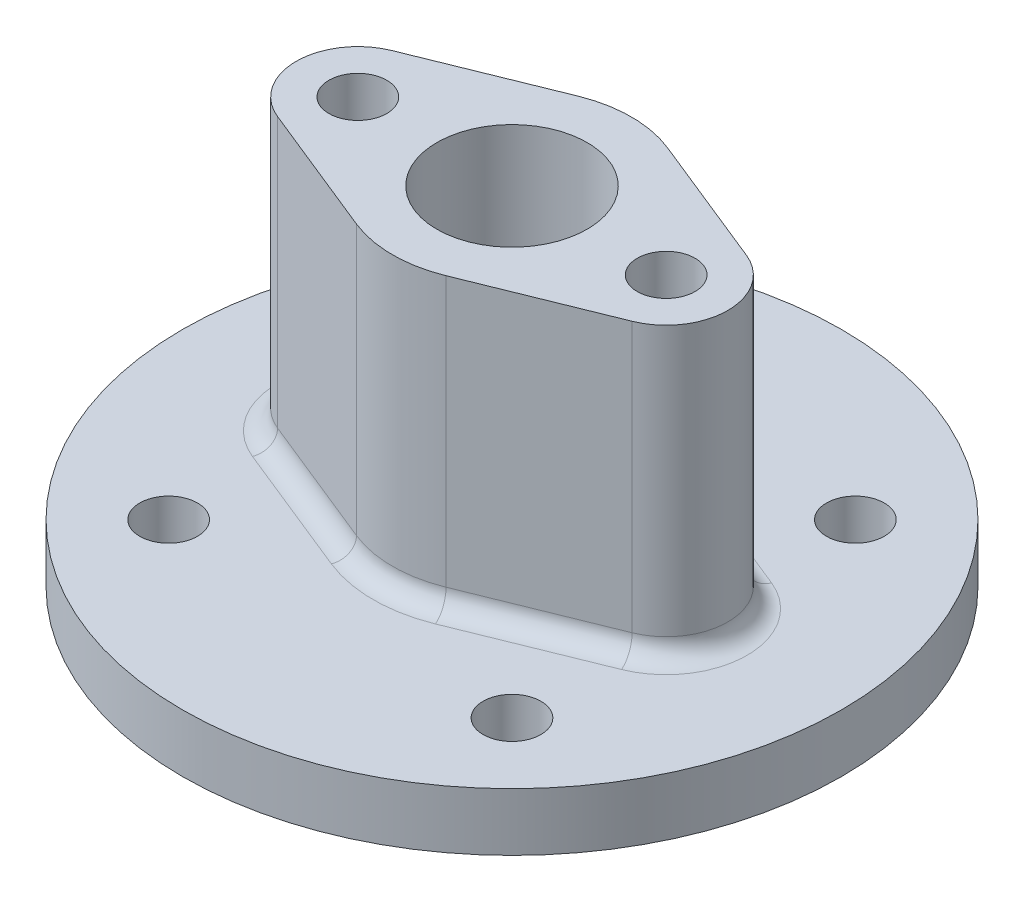
ISO-10303-21;
HEADER;
FILE_DESCRIPTION(('STEP AP214'),'2;1');
FILE_NAME('part.step','',(''),(''),'','','');
FILE_SCHEMA(('AUTOMOTIVE_DESIGN { 1 0 10303 214 1 1 1 1 }'));
ENDSEC;
DATA;
#1=APPLICATION_CONTEXT('core data for automotive mechanical design processes');
#2=APPLICATION_PROTOCOL_DEFINITION('international standard','automotive_design',2000,#1);
#3=PRODUCT_CONTEXT('',#1,'mechanical');
#4=PRODUCT('Part','Part','',(#3));
#5=PRODUCT_RELATED_PRODUCT_CATEGORY('part','',(#4));
#6=PRODUCT_DEFINITION_FORMATION('','',#4);
#7=PRODUCT_DEFINITION_CONTEXT('part definition',#1,'design');
#8=PRODUCT_DEFINITION('design','',#6,#7);
#9=PRODUCT_DEFINITION_SHAPE('','',#8);
#10=(LENGTH_UNIT() NAMED_UNIT(*) SI_UNIT(.MILLI.,.METRE.));
#11=(NAMED_UNIT(*) PLANE_ANGLE_UNIT() SI_UNIT($,.RADIAN.));
#12=(NAMED_UNIT(*) SI_UNIT($,.STERADIAN.) SOLID_ANGLE_UNIT());
#13=UNCERTAINTY_MEASURE_WITH_UNIT(LENGTH_MEASURE(1.E-05),#10,'distance_accuracy_value','');
#14=(GEOMETRIC_REPRESENTATION_CONTEXT(3) GLOBAL_UNCERTAINTY_ASSIGNED_CONTEXT((#13)) GLOBAL_UNIT_ASSIGNED_CONTEXT((#10,
#11,#12)) REPRESENTATION_CONTEXT('',''));
#15=CARTESIAN_POINT('',(0.,0.,0.));
#16=DIRECTION('',(0.,0.,1.));
#17=DIRECTION('',(1.,0.,0.));
#18=AXIS2_PLACEMENT_3D('',#15,#16,#17);
#19=CARTESIAN_POINT('',(11.625,75.,-28.7377691374957));
#20=DIRECTION('',(0.375,0.,-0.927024810886958));
#21=DIRECTION('',(-0.927024810886958,0.,-0.375));
#22=AXIS2_PLACEMENT_3D('',#19,#20,#21);
#23=PLANE('',#22);
#24=DIRECTION('',(0.,-1.,0.));
#25=VECTOR('',#24,1.);
#26=CARTESIAN_POINT('',(46.,75.,-14.8323969741913));
#27=LINE('',#26,#25);
#28=CARTESIAN_POINT('',(46.,75.,-14.8323969741913));
#29=VERTEX_POINT('',#28);
#30=CARTESIAN_POINT('',(46.,5.,-14.8323969741913));
#31=VERTEX_POINT('',#30);
#32=EDGE_CURVE('E243',#29,#31,#27,.T.);
#33=ORIENTED_EDGE('',*,*,#32,.T.);
#34=DIRECTION('',(0.927024810886958,0.,0.375));
#35=VECTOR('',#34,1.);
#36=CARTESIAN_POINT('',(11.625,5.,-28.7377691374957));
#37=LINE('',#36,#35);
#38=CARTESIAN_POINT('',(11.625,5.,-28.7377691374957));
#39=VERTEX_POINT('',#38);
#40=EDGE_CURVE('E316',#31,#39,#37,.F.);
#41=ORIENTED_EDGE('',*,*,#40,.T.);
#42=DIRECTION('',(0.,-1.,0.));
#43=VECTOR('',#42,1.);
#44=CARTESIAN_POINT('',(11.625,75.,-28.7377691374957));
#45=LINE('',#44,#43);
#46=CARTESIAN_POINT('',(11.625,75.,-28.7377691374957));
#47=VERTEX_POINT('',#46);
#48=EDGE_CURVE('E268',#47,#39,#45,.T.);
#49=ORIENTED_EDGE('',*,*,#48,.F.);
#50=DIRECTION('',(0.927024810886958,0.,0.375));
#51=VECTOR('',#50,1.);
#52=CARTESIAN_POINT('',(11.625,75.,-28.7377691374957));
#53=LINE('',#52,#51);
#54=EDGE_CURVE('E198',#47,#29,#53,.T.);
#55=ORIENTED_EDGE('',*,*,#54,.T.);
#56=EDGE_LOOP('',(#33,#41,#49,#55));
#57=FACE_BOUND('',#56,.T.);
#58=ADVANCED_FACE('F53',(#57),#23,.T.);
#59=CARTESIAN_POINT('',(0.,75.,0.));
#60=DIRECTION('',(0.,-1.,0.));
#61=DIRECTION('',(0.,0.,-1.));
#62=AXIS2_PLACEMENT_3D('',#59,#60,#61);
#63=CYLINDRICAL_SURFACE('',#62,31.);
#64=ORIENTED_EDGE('',*,*,#48,.T.);
#65=CARTESIAN_POINT('',(0.,5.,0.));
#66=DIRECTION('',(0.,1.,0.));
#67=DIRECTION('',(0.,0.,1.));
#68=AXIS2_PLACEMENT_3D('',#65,#66,#67);
#69=CIRCLE('',#68,31.);
#70=CARTESIAN_POINT('',(-11.625,5.,-28.7377691374957));
#71=VERTEX_POINT('',#70);
#72=EDGE_CURVE('E313',#39,#71,#69,.T.);
#73=ORIENTED_EDGE('',*,*,#72,.T.);
#74=DIRECTION('',(0.,-1.,0.));
#75=VECTOR('',#74,1.);
#76=CARTESIAN_POINT('',(-11.625,75.,-28.7377691374957));
#77=LINE('',#76,#75);
#78=CARTESIAN_POINT('',(-11.625,75.,-28.7377691374957));
#79=VERTEX_POINT('',#78);
#80=EDGE_CURVE('E264',#79,#71,#77,.T.);
#81=ORIENTED_EDGE('',*,*,#80,.F.);
#82=CARTESIAN_POINT('',(0.,75.,0.));
#83=DIRECTION('',(0.,1.,0.));
#84=DIRECTION('',(0.,0.,1.));
#85=AXIS2_PLACEMENT_3D('',#82,#83,#84);
#86=CIRCLE('',#85,31.);
#87=EDGE_CURVE('E220',#47,#79,#86,.T.);
#88=ORIENTED_EDGE('',*,*,#87,.F.);
#89=EDGE_LOOP('',(#64,#73,#81,#88));
#90=FACE_BOUND('',#89,.T.);
#91=ADVANCED_FACE('F467',(#90),#63,.T.);
#92=CARTESIAN_POINT('',(-11.625,75.,-28.7377691374957));
#93=DIRECTION('',(0.375,0.,0.927024810886958));
#94=DIRECTION('',(0.927024810886958,0.,-0.375));
#95=AXIS2_PLACEMENT_3D('',#92,#93,#94);
#96=PLANE('',#95);
#97=ORIENTED_EDGE('',*,*,#80,.T.);
#98=DIRECTION('',(-0.927024810886958,0.,0.375));
#99=VECTOR('',#98,1.);
#100=CARTESIAN_POINT('',(-11.625,5.,-28.7377691374957));
#101=LINE('',#100,#99);
#102=CARTESIAN_POINT('',(-46.,5.,-14.8323969741913));
#103=VERTEX_POINT('',#102);
#104=EDGE_CURVE('E310',#71,#103,#101,.T.);
#105=ORIENTED_EDGE('',*,*,#104,.T.);
#106=DIRECTION('',(0.,-1.,0.));
#107=VECTOR('',#106,1.);
#108=CARTESIAN_POINT('',(-46.,75.,-14.8323969741913));
#109=LINE('',#108,#107);
#110=CARTESIAN_POINT('',(-46.,75.,-14.8323969741913));
#111=VERTEX_POINT('',#110);
#112=EDGE_CURVE('E260',#111,#103,#109,.T.);
#113=ORIENTED_EDGE('',*,*,#112,.F.);
#114=DIRECTION('',(-0.927024810886958,0.,0.375));
#115=VECTOR('',#114,1.);
#116=CARTESIAN_POINT('',(-11.625,75.,-28.7377691374957));
#117=LINE('',#116,#115);
#118=EDGE_CURVE('E223',#79,#111,#117,.T.);
#119=ORIENTED_EDGE('',*,*,#118,.F.);
#120=EDGE_LOOP('',(#97,#105,#113,#119));
#121=FACE_BOUND('',#120,.T.);
#122=ADVANCED_FACE('F473',(#121),#96,.F.);
#123=CARTESIAN_POINT('',(-40.,75.,0.));
#124=DIRECTION('',(0.,-1.,0.));
#125=DIRECTION('',(0.,0.,-1.));
#126=AXIS2_PLACEMENT_3D('',#123,#124,#125);
#127=CYLINDRICAL_SURFACE('',#126,16.);
#128=ORIENTED_EDGE('',*,*,#112,.T.);
#129=CARTESIAN_POINT('',(-40.,5.,0.));
#130=DIRECTION('',(0.,1.,0.));
#131=DIRECTION('',(0.,0.,1.));
#132=AXIS2_PLACEMENT_3D('',#129,#130,#131);
#133=CIRCLE('',#132,16.);
#134=CARTESIAN_POINT('',(-46.,5.,14.8323969741913));
#135=VERTEX_POINT('',#134);
#136=EDGE_CURVE('E307',#103,#135,#133,.T.);
#137=ORIENTED_EDGE('',*,*,#136,.T.);
#138=DIRECTION('',(0.,-1.,0.));
#139=VECTOR('',#138,1.);
#140=CARTESIAN_POINT('',(-46.,75.,14.8323969741913));
#141=LINE('',#140,#139);
#142=CARTESIAN_POINT('',(-46.,75.,14.8323969741913));
#143=VERTEX_POINT('',#142);
#144=EDGE_CURVE('E256',#143,#135,#141,.T.);
#145=ORIENTED_EDGE('',*,*,#144,.F.);
#146=CARTESIAN_POINT('',(-40.,75.,0.));
#147=DIRECTION('',(0.,1.,0.));
#148=DIRECTION('',(0.,0.,1.));
#149=AXIS2_PLACEMENT_3D('',#146,#147,#148);
#150=CIRCLE('',#149,16.);
#151=EDGE_CURVE('E226',#143,#111,#150,.F.);
#152=ORIENTED_EDGE('',*,*,#151,.T.);
#153=EDGE_LOOP('',(#128,#137,#145,#152));
#154=FACE_BOUND('',#153,.T.);
#155=ADVANCED_FACE('F540',(#154),#127,.T.);
#156=CARTESIAN_POINT('',(-11.625,75.,28.7377691374957));
#157=DIRECTION('',(-0.375,0.,0.927024810886958));
#158=DIRECTION('',(0.927024810886958,0.,0.375));
#159=AXIS2_PLACEMENT_3D('',#156,#157,#158);
#160=PLANE('',#159);
#161=ORIENTED_EDGE('',*,*,#144,.T.);
#162=DIRECTION('',(-0.927024810886958,0.,-0.375));
#163=VECTOR('',#162,1.);
#164=CARTESIAN_POINT('',(-11.625,5.,28.7377691374957));
#165=LINE('',#164,#163);
#166=CARTESIAN_POINT('',(-11.625,5.,28.7377691374957));
#167=VERTEX_POINT('',#166);
#168=EDGE_CURVE('E303',#135,#167,#165,.F.);
#169=ORIENTED_EDGE('',*,*,#168,.T.);
#170=DIRECTION('',(0.,-1.,0.));
#171=VECTOR('',#170,1.);
#172=CARTESIAN_POINT('',(-11.625,75.,28.7377691374957));
#173=LINE('',#172,#171);
#174=CARTESIAN_POINT('',(-11.625,75.,28.7377691374957));
#175=VERTEX_POINT('',#174);
#176=EDGE_CURVE('E253',#175,#167,#173,.T.);
#177=ORIENTED_EDGE('',*,*,#176,.F.);
#178=DIRECTION('',(-0.927024810886958,0.,-0.375));
#179=VECTOR('',#178,1.);
#180=CARTESIAN_POINT('',(-11.625,75.,28.7377691374957));
#181=LINE('',#180,#179);
#182=EDGE_CURVE('E230',#175,#143,#181,.T.);
#183=ORIENTED_EDGE('',*,*,#182,.T.);
#184=EDGE_LOOP('',(#161,#169,#177,#183));
#185=FACE_BOUND('',#184,.T.);
#186=ADVANCED_FACE('F543',(#185),#160,.T.);
#187=CARTESIAN_POINT('',(0.,75.,0.));
#188=DIRECTION('',(0.,-1.,0.));
#189=DIRECTION('',(0.,0.,-1.));
#190=AXIS2_PLACEMENT_3D('',#187,#188,#189);
#191=CYLINDRICAL_SURFACE('',#190,31.);
#192=ORIENTED_EDGE('',*,*,#176,.T.);
#193=CARTESIAN_POINT('',(0.,5.,0.));
#194=DIRECTION('',(0.,1.,0.));
#195=DIRECTION('',(0.,0.,1.));
#196=AXIS2_PLACEMENT_3D('',#193,#194,#195);
#197=CIRCLE('',#196,31.);
#198=CARTESIAN_POINT('',(11.625,5.,28.7377691374957));
#199=VERTEX_POINT('',#198);
#200=EDGE_CURVE('E12',#167,#199,#197,.T.);
#201=ORIENTED_EDGE('',*,*,#200,.T.);
#202=DIRECTION('',(0.,-1.,0.));
#203=VECTOR('',#202,1.);
#204=CARTESIAN_POINT('',(11.625,75.,28.7377691374957));
#205=LINE('',#204,#203);
#206=CARTESIAN_POINT('',(11.625,75.,28.7377691374957));
#207=VERTEX_POINT('',#206);
#208=EDGE_CURVE('E250',#207,#199,#205,.T.);
#209=ORIENTED_EDGE('',*,*,#208,.F.);
#210=CARTESIAN_POINT('',(0.,75.,0.));
#211=DIRECTION('',(0.,1.,0.));
#212=DIRECTION('',(0.,0.,1.));
#213=AXIS2_PLACEMENT_3D('',#210,#211,#212);
#214=CIRCLE('',#213,31.);
#215=EDGE_CURVE('E234',#175,#207,#214,.T.);
#216=ORIENTED_EDGE('',*,*,#215,.F.);
#217=EDGE_LOOP('',(#192,#201,#209,#216));
#218=FACE_BOUND('',#217,.T.);
#219=ADVANCED_FACE('F547',(#218),#191,.T.);
#220=CARTESIAN_POINT('',(11.625,75.,28.7377691374957));
#221=DIRECTION('',(-0.375,0.,-0.927024810886958));
#222=DIRECTION('',(-0.927024810886958,0.,0.375));
#223=AXIS2_PLACEMENT_3D('',#220,#221,#222);
#224=PLANE('',#223);
#225=ORIENTED_EDGE('',*,*,#208,.T.);
#226=DIRECTION('',(0.927024810886958,0.,-0.375));
#227=VECTOR('',#226,1.);
#228=CARTESIAN_POINT('',(11.625,5.,28.7377691374957));
#229=LINE('',#228,#227);
#230=CARTESIAN_POINT('',(46.,5.,14.8323969741913));
#231=VERTEX_POINT('',#230);
#232=EDGE_CURVE('E63',#199,#231,#229,.T.);
#233=ORIENTED_EDGE('',*,*,#232,.T.);
#234=DIRECTION('',(0.,-1.,0.));
#235=VECTOR('',#234,1.);
#236=CARTESIAN_POINT('',(46.,75.,14.8323969741913));
#237=LINE('',#236,#235);
#238=CARTESIAN_POINT('',(46.,75.,14.8323969741913));
#239=VERTEX_POINT('',#238);
#240=EDGE_CURVE('E247',#239,#231,#237,.T.);
#241=ORIENTED_EDGE('',*,*,#240,.F.);
#242=DIRECTION('',(0.927024810886958,0.,-0.375));
#243=VECTOR('',#242,1.);
#244=CARTESIAN_POINT('',(11.625,75.,28.7377691374957));
#245=LINE('',#244,#243);
#246=EDGE_CURVE('E237',#207,#239,#245,.T.);
#247=ORIENTED_EDGE('',*,*,#246,.F.);
#248=EDGE_LOOP('',(#225,#233,#241,#247));
#249=FACE_BOUND('',#248,.T.);
#250=ADVANCED_FACE('F548',(#249),#224,.F.);
#251=CARTESIAN_POINT('',(40.,75.,0.));
#252=DIRECTION('',(0.,-1.,0.));
#253=DIRECTION('',(0.,0.,-1.));
#254=AXIS2_PLACEMENT_3D('',#251,#252,#253);
#255=CYLINDRICAL_SURFACE('',#254,16.);
#256=ORIENTED_EDGE('',*,*,#240,.T.);
#257=CARTESIAN_POINT('',(40.,5.,0.));
#258=DIRECTION('',(0.,1.,0.));
#259=DIRECTION('',(0.,0.,1.));
#260=AXIS2_PLACEMENT_3D('',#257,#258,#259);
#261=CIRCLE('',#260,16.);
#262=EDGE_CURVE('E319',#231,#31,#261,.T.);
#263=ORIENTED_EDGE('',*,*,#262,.T.);
#264=ORIENTED_EDGE('',*,*,#32,.F.);
#265=CARTESIAN_POINT('',(40.,75.,0.));
#266=DIRECTION('',(0.,1.,0.));
#267=DIRECTION('',(0.,0.,1.));
#268=AXIS2_PLACEMENT_3D('',#265,#266,#267);
#269=CIRCLE('',#268,16.);
#270=EDGE_CURVE('E240',#239,#29,#269,.T.);
#271=ORIENTED_EDGE('',*,*,#270,.F.);
#272=EDGE_LOOP('',(#256,#263,#264,#271));
#273=FACE_BOUND('',#272,.T.);
#274=ADVANCED_FACE('F462',(#273),#255,.T.);
#275=CARTESIAN_POINT('',(0.,75.,0.));
#276=DIRECTION('',(0.,1.,0.));
#277=DIRECTION('',(0.,0.,1.));
#278=AXIS2_PLACEMENT_3D('',#275,#276,#277);
#279=PLANE('',#278);
#280=CARTESIAN_POINT('',(0.,75.,0.));
#281=DIRECTION('',(0.,1.,0.));
#282=DIRECTION('',(0.,0.,1.));
#283=AXIS2_PLACEMENT_3D('',#280,#281,#282);
#284=CIRCLE('',#283,19.5);
#285=CARTESIAN_POINT('',(0.,75.,19.5));
#286=VERTEX_POINT('',#285);
#287=EDGE_CURVE('E278',#286,#286,#284,.T.);
#288=ORIENTED_EDGE('',*,*,#287,.F.);
#289=EDGE_LOOP('',(#288));
#290=FACE_BOUND('',#289,.T.);
#291=CARTESIAN_POINT('',(-40.,75.,0.));
#292=DIRECTION('',(0.,1.,0.));
#293=DIRECTION('',(0.,0.,1.));
#294=AXIS2_PLACEMENT_3D('',#291,#292,#293);
#295=CIRCLE('',#294,7.49999999999999);
#296=CARTESIAN_POINT('',(-40.,75.,7.49999999999998));
#297=VERTEX_POINT('',#296);
#298=EDGE_CURVE('E161',#297,#297,#295,.T.);
#299=ORIENTED_EDGE('',*,*,#298,.F.);
#300=EDGE_LOOP('',(#299));
#301=FACE_BOUND('',#300,.T.);
#302=CARTESIAN_POINT('',(40.,75.,0.));
#303=DIRECTION('',(0.,1.,0.));
#304=DIRECTION('',(0.,0.,1.));
#305=AXIS2_PLACEMENT_3D('',#302,#303,#304);
#306=CIRCLE('',#305,7.49999999999999);
#307=CARTESIAN_POINT('',(40.,75.,7.49999999999998));
#308=VERTEX_POINT('',#307);
#309=EDGE_CURVE('E160',#308,#308,#306,.T.);
#310=ORIENTED_EDGE('',*,*,#309,.F.);
#311=EDGE_LOOP('',(#310));
#312=FACE_BOUND('',#311,.T.);
#313=ORIENTED_EDGE('',*,*,#54,.F.);
#314=ORIENTED_EDGE('',*,*,#87,.T.);
#315=ORIENTED_EDGE('',*,*,#118,.T.);
#316=ORIENTED_EDGE('',*,*,#151,.F.);
#317=ORIENTED_EDGE('',*,*,#182,.F.);
#318=ORIENTED_EDGE('',*,*,#215,.T.);
#319=ORIENTED_EDGE('',*,*,#246,.T.);
#320=ORIENTED_EDGE('',*,*,#270,.T.);
#321=EDGE_LOOP('',(#313,#314,#315,#316,#317,#318,#319,#320));
#322=FACE_BOUND('',#321,.T.);
#323=ADVANCED_FACE('F456',(#290,#301,#312,#322),#279,.T.);
#324=CARTESIAN_POINT('',(0.,0.,0.));
#325=DIRECTION('',(0.,1.,0.));
#326=DIRECTION('',(0.,0.,1.));
#327=AXIS2_PLACEMENT_3D('',#324,#325,#326);
#328=PLANE('',#327);
#329=CARTESIAN_POINT('',(0.,0.,0.));
#330=DIRECTION('',(0.,1.,0.));
#331=DIRECTION('',(0.,0.,1.));
#332=AXIS2_PLACEMENT_3D('',#329,#330,#331);
#333=CIRCLE('',#332,36.);
#334=CARTESIAN_POINT('',(13.5,0.,33.3728931919305));
#335=VERTEX_POINT('',#334);
#336=CARTESIAN_POINT('',(-13.5,0.,33.3728931919305));
#337=VERTEX_POINT('',#336);
#338=EDGE_CURVE('E272',#335,#337,#333,.F.);
#339=ORIENTED_EDGE('',*,*,#338,.T.);
#340=DIRECTION('',(-0.927024810886958,0.,-0.375));
#341=VECTOR('',#340,1.);
#342=CARTESIAN_POINT('',(-47.875,0.,19.4675210286261));
#343=LINE('',#342,#341);
#344=CARTESIAN_POINT('',(-47.875,0.,19.4675210286261));
#345=VERTEX_POINT('',#344);
#346=EDGE_CURVE('E299',#337,#345,#343,.T.);
#347=ORIENTED_EDGE('',*,*,#346,.T.);
#348=CARTESIAN_POINT('',(-40.,0.,0.));
#349=DIRECTION('',(0.,1.,0.));
#350=DIRECTION('',(0.,0.,1.));
#351=AXIS2_PLACEMENT_3D('',#348,#349,#350);
#352=CIRCLE('',#351,21.);
#353=CARTESIAN_POINT('',(-47.875,0.,-19.4675210286261));
#354=VERTEX_POINT('',#353);
#355=EDGE_CURVE('E296',#345,#354,#352,.F.);
#356=ORIENTED_EDGE('',*,*,#355,.T.);
#357=DIRECTION('',(-0.927024810886958,0.,0.375));
#358=VECTOR('',#357,1.);
#359=CARTESIAN_POINT('',(-13.5,0.,-33.3728931919305));
#360=LINE('',#359,#358);
#361=CARTESIAN_POINT('',(-13.5,0.,-33.3728931919305));
#362=VERTEX_POINT('',#361);
#363=EDGE_CURVE('E293',#354,#362,#360,.F.);
#364=ORIENTED_EDGE('',*,*,#363,.T.);
#365=CARTESIAN_POINT('',(0.,0.,0.));
#366=DIRECTION('',(0.,1.,0.));
#367=DIRECTION('',(0.,0.,1.));
#368=AXIS2_PLACEMENT_3D('',#365,#366,#367);
#369=CIRCLE('',#368,36.);
#370=CARTESIAN_POINT('',(13.5,0.,-33.3728931919305));
#371=VERTEX_POINT('',#370);
#372=EDGE_CURVE('E290',#362,#371,#369,.F.);
#373=ORIENTED_EDGE('',*,*,#372,.T.);
#374=DIRECTION('',(0.927024810886958,0.,0.375));
#375=VECTOR('',#374,1.);
#376=CARTESIAN_POINT('',(47.875,0.,-19.4675210286261));
#377=LINE('',#376,#375);
#378=CARTESIAN_POINT('',(47.875,0.,-19.4675210286261));
#379=VERTEX_POINT('',#378);
#380=EDGE_CURVE('E287',#371,#379,#377,.T.);
#381=ORIENTED_EDGE('',*,*,#380,.T.);
#382=CARTESIAN_POINT('',(40.,0.,0.));
#383=DIRECTION('',(0.,1.,0.));
#384=DIRECTION('',(0.,0.,1.));
#385=AXIS2_PLACEMENT_3D('',#382,#383,#384);
#386=CIRCLE('',#385,21.);
#387=CARTESIAN_POINT('',(47.875,0.,19.4675210286261));
#388=VERTEX_POINT('',#387);
#389=EDGE_CURVE('E284',#379,#388,#386,.F.);
#390=ORIENTED_EDGE('',*,*,#389,.T.);
#391=DIRECTION('',(0.927024810886958,0.,-0.375));
#392=VECTOR('',#391,1.);
#393=CARTESIAN_POINT('',(13.5,0.,33.3728931919305));
#394=LINE('',#393,#392);
#395=EDGE_CURVE('E281',#388,#335,#394,.F.);
#396=ORIENTED_EDGE('',*,*,#395,.T.);
#397=EDGE_LOOP('',(#339,#347,#356,#364,#373,#381,#390,#396));
#398=FACE_BOUND('',#397,.T.);
#399=CARTESIAN_POINT('',(-44.5477272147523,0.,-44.5477272147527));
#400=DIRECTION('',(0.,1.,0.));
#401=DIRECTION('',(0.,0.,1.));
#402=AXIS2_PLACEMENT_3D('',#399,#400,#401);
#403=CIRCLE('',#402,7.50000000000001);
#404=CARTESIAN_POINT('',(-44.5477272147523,0.,-37.0477272147527));
#405=VERTEX_POINT('',#404);
#406=EDGE_CURVE('E176',#405,#405,#403,.T.);
#407=ORIENTED_EDGE('',*,*,#406,.F.);
#408=EDGE_LOOP('',(#407));
#409=FACE_BOUND('',#408,.T.);
#410=CARTESIAN_POINT('',(-44.5477272147527,0.,44.5477272147523));
#411=DIRECTION('',(0.,1.,0.));
#412=DIRECTION('',(0.,0.,1.));
#413=AXIS2_PLACEMENT_3D('',#410,#411,#412);
#414=CIRCLE('',#413,7.5);
#415=CARTESIAN_POINT('',(-44.5477272147527,0.,52.0477272147523));
#416=VERTEX_POINT('',#415);
#417=EDGE_CURVE('E202',#416,#416,#414,.T.);
#418=ORIENTED_EDGE('',*,*,#417,.F.);
#419=EDGE_LOOP('',(#418));
#420=FACE_BOUND('',#419,.T.);
#421=CARTESIAN_POINT('',(44.5477272147523,0.,44.5477272147527));
#422=DIRECTION('',(0.,1.,0.));
#423=DIRECTION('',(0.,0.,1.));
#424=AXIS2_PLACEMENT_3D('',#421,#422,#423);
#425=CIRCLE('',#424,7.50000000000001);
#426=CARTESIAN_POINT('',(44.5477272147523,0.,52.0477272147527));
#427=VERTEX_POINT('',#426);
#428=EDGE_CURVE('E206',#427,#427,#425,.T.);
#429=ORIENTED_EDGE('',*,*,#428,.F.);
#430=EDGE_LOOP('',(#429));
#431=FACE_BOUND('',#430,.T.);
#432=CARTESIAN_POINT('',(44.5477272147527,0.,-44.5477272147523));
#433=DIRECTION('',(0.,1.,0.));
#434=DIRECTION('',(0.,0.,1.));
#435=AXIS2_PLACEMENT_3D('',#432,#433,#434);
#436=CIRCLE('',#435,7.49999999999999);
#437=CARTESIAN_POINT('',(44.5477272147527,0.,-37.0477272147523));
#438=VERTEX_POINT('',#437);
#439=EDGE_CURVE('E210',#438,#438,#436,.T.);
#440=ORIENTED_EDGE('',*,*,#439,.F.);
#441=EDGE_LOOP('',(#440));
#442=FACE_BOUND('',#441,.T.);
#443=CARTESIAN_POINT('',(0.,0.,0.));
#444=DIRECTION('',(0.,1.,0.));
#445=DIRECTION('',(0.,0.,1.));
#446=AXIS2_PLACEMENT_3D('',#443,#444,#445);
#447=CIRCLE('',#446,85.5);
#448=CARTESIAN_POINT('',(0.,0.,85.5));
#449=VERTEX_POINT('',#448);
#450=EDGE_CURVE('E182',#449,#449,#447,.T.);
#451=ORIENTED_EDGE('',*,*,#450,.T.);
#452=EDGE_LOOP('',(#451));
#453=FACE_BOUND('',#452,.T.);
#454=ADVANCED_FACE('F451',(#398,#409,#420,#431,#442,#453),#328,.T.);
#455=CARTESIAN_POINT('',(0.,-15.,0.));
#456=DIRECTION('',(0.,1.,0.));
#457=DIRECTION('',(0.,0.,1.));
#458=AXIS2_PLACEMENT_3D('',#455,#456,#457);
#459=CYLINDRICAL_SURFACE('',#458,85.5);
#460=CARTESIAN_POINT('',(0.,-15.,0.));
#461=DIRECTION('',(0.,1.,0.));
#462=DIRECTION('',(0.,0.,1.));
#463=AXIS2_PLACEMENT_3D('',#460,#461,#462);
#464=CIRCLE('',#463,85.5);
#465=CARTESIAN_POINT('',(0.,-15.,85.5));
#466=VERTEX_POINT('',#465);
#467=EDGE_CURVE('E194',#466,#466,#464,.T.);
#468=ORIENTED_EDGE('',*,*,#467,.T.);
#469=EDGE_LOOP('',(#468));
#470=FACE_BOUND('',#469,.T.);
#471=ORIENTED_EDGE('',*,*,#450,.F.);
#472=EDGE_LOOP('',(#471));
#473=FACE_BOUND('',#472,.T.);
#474=ADVANCED_FACE('F447',(#470,#473),#459,.T.);
#475=CARTESIAN_POINT('',(44.5477272147527,-15.,-44.5477272147523));
#476=DIRECTION('',(0.,1.,0.));
#477=DIRECTION('',(0.,0.,1.));
#478=AXIS2_PLACEMENT_3D('',#475,#476,#477);
#479=CYLINDRICAL_SURFACE('',#478,7.49999999999999);
#480=CARTESIAN_POINT('',(44.5477272147527,-15.,-44.5477272147523));
#481=DIRECTION('',(0.,1.,0.));
#482=DIRECTION('',(0.,0.,1.));
#483=AXIS2_PLACEMENT_3D('',#480,#481,#482);
#484=CIRCLE('',#483,7.49999999999999);
#485=CARTESIAN_POINT('',(44.5477272147527,-15.,-37.0477272147523));
#486=VERTEX_POINT('',#485);
#487=EDGE_CURVE('E190',#486,#486,#484,.T.);
#488=ORIENTED_EDGE('',*,*,#487,.F.);
#489=EDGE_LOOP('',(#488));
#490=FACE_BOUND('',#489,.T.);
#491=ORIENTED_EDGE('',*,*,#439,.T.);
#492=EDGE_LOOP('',(#491));
#493=FACE_BOUND('',#492,.T.);
#494=ADVANCED_FACE('F450',(#490,#493),#479,.F.);
#495=CARTESIAN_POINT('',(44.5477272147523,-15.,44.5477272147527));
#496=DIRECTION('',(0.,1.,0.));
#497=DIRECTION('',(0.,0.,1.));
#498=AXIS2_PLACEMENT_3D('',#495,#496,#497);
#499=CYLINDRICAL_SURFACE('',#498,7.50000000000001);
#500=CARTESIAN_POINT('',(44.5477272147523,-15.,44.5477272147527));
#501=DIRECTION('',(0.,1.,0.));
#502=DIRECTION('',(0.,0.,1.));
#503=AXIS2_PLACEMENT_3D('',#500,#501,#502);
#504=CIRCLE('',#503,7.50000000000001);
#505=CARTESIAN_POINT('',(44.5477272147523,-15.,52.0477272147527));
#506=VERTEX_POINT('',#505);
#507=EDGE_CURVE('E186',#506,#506,#504,.T.);
#508=ORIENTED_EDGE('',*,*,#507,.F.);
#509=EDGE_LOOP('',(#508));
#510=FACE_BOUND('',#509,.T.);
#511=ORIENTED_EDGE('',*,*,#428,.T.);
#512=EDGE_LOOP('',(#511));
#513=FACE_BOUND('',#512,.T.);
#514=ADVANCED_FACE('F789',(#510,#513),#499,.F.);
#515=CARTESIAN_POINT('',(-44.5477272147527,-15.,44.5477272147523));
#516=DIRECTION('',(0.,1.,0.));
#517=DIRECTION('',(0.,0.,1.));
#518=AXIS2_PLACEMENT_3D('',#515,#516,#517);
#519=CYLINDRICAL_SURFACE('',#518,7.5);
#520=CARTESIAN_POINT('',(-44.5477272147527,-15.,44.5477272147523));
#521=DIRECTION('',(0.,1.,0.));
#522=DIRECTION('',(0.,0.,1.));
#523=AXIS2_PLACEMENT_3D('',#520,#521,#522);
#524=CIRCLE('',#523,7.5);
#525=CARTESIAN_POINT('',(-44.5477272147527,-15.,52.0477272147523));
#526=VERTEX_POINT('',#525);
#527=EDGE_CURVE('E181',#526,#526,#524,.T.);
#528=ORIENTED_EDGE('',*,*,#527,.F.);
#529=EDGE_LOOP('',(#528));
#530=FACE_BOUND('',#529,.T.);
#531=ORIENTED_EDGE('',*,*,#417,.T.);
#532=EDGE_LOOP('',(#531));
#533=FACE_BOUND('',#532,.T.);
#534=ADVANCED_FACE('F779',(#530,#533),#519,.F.);
#535=CARTESIAN_POINT('',(-44.5477272147523,-15.,-44.5477272147527));
#536=DIRECTION('',(0.,1.,0.));
#537=DIRECTION('',(0.,0.,1.));
#538=AXIS2_PLACEMENT_3D('',#535,#536,#537);
#539=CYLINDRICAL_SURFACE('',#538,7.50000000000001);
#540=CARTESIAN_POINT('',(-44.5477272147523,-15.,-44.5477272147527));
#541=DIRECTION('',(0.,1.,0.));
#542=DIRECTION('',(0.,0.,1.));
#543=AXIS2_PLACEMENT_3D('',#540,#541,#542);
#544=CIRCLE('',#543,7.50000000000001);
#545=CARTESIAN_POINT('',(-44.5477272147523,-15.,-37.0477272147527));
#546=VERTEX_POINT('',#545);
#547=EDGE_CURVE('E177',#546,#546,#544,.T.);
#548=ORIENTED_EDGE('',*,*,#547,.F.);
#549=EDGE_LOOP('',(#548));
#550=FACE_BOUND('',#549,.T.);
#551=ORIENTED_EDGE('',*,*,#406,.T.);
#552=EDGE_LOOP('',(#551));
#553=FACE_BOUND('',#552,.T.);
#554=ADVANCED_FACE('F435',(#550,#553),#539,.F.);
#555=CARTESIAN_POINT('',(0.,-15.,0.));
#556=DIRECTION('',(0.,1.,0.));
#557=DIRECTION('',(0.,0.,1.));
#558=AXIS2_PLACEMENT_3D('',#555,#556,#557);
#559=PLANE('',#558);
#560=CARTESIAN_POINT('',(0.,-15.,0.));
#561=DIRECTION('',(0.,-1.,0.));
#562=DIRECTION('',(0.,0.,-1.));
#563=AXIS2_PLACEMENT_3D('',#560,#561,#562);
#564=CIRCLE('',#563,42.);
#565=CARTESIAN_POINT('',(0.,-15.,-42.));
#566=VERTEX_POINT('',#565);
#567=EDGE_CURVE('E277',#566,#566,#564,.T.);
#568=ORIENTED_EDGE('',*,*,#567,.F.);
#569=EDGE_LOOP('',(#568));
#570=FACE_BOUND('',#569,.T.);
#571=ORIENTED_EDGE('',*,*,#547,.T.);
#572=EDGE_LOOP('',(#571));
#573=FACE_BOUND('',#572,.T.);
#574=ORIENTED_EDGE('',*,*,#527,.T.);
#575=EDGE_LOOP('',(#574));
#576=FACE_BOUND('',#575,.T.);
#577=ORIENTED_EDGE('',*,*,#507,.T.);
#578=EDGE_LOOP('',(#577));
#579=FACE_BOUND('',#578,.T.);
#580=ORIENTED_EDGE('',*,*,#487,.T.);
#581=EDGE_LOOP('',(#580));
#582=FACE_BOUND('',#581,.T.);
#583=ORIENTED_EDGE('',*,*,#467,.F.);
#584=EDGE_LOOP('',(#583));
#585=FACE_BOUND('',#584,.T.);
#586=ADVANCED_FACE('F431',(#570,#573,#576,#579,#582,#585),#559,.F.);
#587=CARTESIAN_POINT('',(40.,49.5064546427067,0.));
#588=DIRECTION('',(0.,1.,0.));
#589=DIRECTION('',(0.,0.,1.));
#590=AXIS2_PLACEMENT_3D('',#587,#588,#589);
#591=CONICAL_SURFACE('',#590,7.49999999999999,1.02974425867665);
#592=CARTESIAN_POINT('',(40.,45.,0.));
#593=VERTEX_POINT('',#592);
#594=VERTEX_LOOP('',#593);
#595=FACE_BOUND('',#594,.T.);
#596=CARTESIAN_POINT('',(40.,49.5064546427067,0.));
#597=DIRECTION('',(0.,1.,0.));
#598=DIRECTION('',(0.,0.,1.));
#599=AXIS2_PLACEMENT_3D('',#596,#597,#598);
#600=CIRCLE('',#599,7.49999999999999);
#601=CARTESIAN_POINT('',(40.,49.5064546427067,7.49999999999999));
#602=VERTEX_POINT('',#601);
#603=EDGE_CURVE('E166',#602,#602,#600,.T.);
#604=ORIENTED_EDGE('',*,*,#603,.T.);
#605=EDGE_LOOP('',(#604));
#606=FACE_BOUND('',#605,.T.);
#607=ADVANCED_FACE('F434',(#595,#606),#591,.F.);
#608=CARTESIAN_POINT('',(40.,75.,0.));
#609=DIRECTION('',(0.,1.,0.));
#610=DIRECTION('',(0.,0.,1.));
#611=AXIS2_PLACEMENT_3D('',#608,#609,#610);
#612=CYLINDRICAL_SURFACE('',#611,7.49999999999999);
#613=ORIENTED_EDGE('',*,*,#603,.F.);
#614=EDGE_LOOP('',(#613));
#615=FACE_BOUND('',#614,.T.);
#616=ORIENTED_EDGE('',*,*,#309,.T.);
#617=EDGE_LOOP('',(#616));
#618=FACE_BOUND('',#617,.T.);
#619=ADVANCED_FACE('F153',(#615,#618),#612,.F.);
#620=CARTESIAN_POINT('',(-40.,49.5064546427067,0.));
#621=DIRECTION('',(0.,1.,0.));
#622=DIRECTION('',(0.,0.,1.));
#623=AXIS2_PLACEMENT_3D('',#620,#621,#622);
#624=CONICAL_SURFACE('',#623,7.49999999999999,1.02974425867665);
#625=CARTESIAN_POINT('',(-40.,45.,0.));
#626=VERTEX_POINT('',#625);
#627=VERTEX_LOOP('',#626);
#628=FACE_BOUND('',#627,.T.);
#629=CARTESIAN_POINT('',(-40.,49.5064546427067,0.));
#630=DIRECTION('',(0.,1.,0.));
#631=DIRECTION('',(0.,0.,1.));
#632=AXIS2_PLACEMENT_3D('',#629,#630,#631);
#633=CIRCLE('',#632,7.49999999999999);
#634=CARTESIAN_POINT('',(-40.,49.5064546427067,7.49999999999999));
#635=VERTEX_POINT('',#634);
#636=EDGE_CURVE('E157',#635,#635,#633,.T.);
#637=ORIENTED_EDGE('',*,*,#636,.T.);
#638=EDGE_LOOP('',(#637));
#639=FACE_BOUND('',#638,.T.);
#640=ADVANCED_FACE('F149',(#628,#639),#624,.F.);
#641=CARTESIAN_POINT('',(-40.,75.,0.));
#642=DIRECTION('',(0.,1.,0.));
#643=DIRECTION('',(0.,0.,1.));
#644=AXIS2_PLACEMENT_3D('',#641,#642,#643);
#645=CYLINDRICAL_SURFACE('',#644,7.49999999999999);
#646=ORIENTED_EDGE('',*,*,#636,.F.);
#647=EDGE_LOOP('',(#646));
#648=FACE_BOUND('',#647,.T.);
#649=ORIENTED_EDGE('',*,*,#298,.T.);
#650=EDGE_LOOP('',(#649));
#651=FACE_BOUND('',#650,.T.);
#652=ADVANCED_FACE('F152',(#648,#651),#645,.F.);
#653=CARTESIAN_POINT('',(0.,-57.,0.));
#654=DIRECTION('',(0.,-1.,0.));
#655=DIRECTION('',(0.,0.,-1.));
#656=AXIS2_PLACEMENT_3D('',#653,#654,#655);
#657=PLANE('',#656);
#658=CARTESIAN_POINT('',(0.,-57.,0.));
#659=DIRECTION('',(0.,-1.,0.));
#660=DIRECTION('',(0.,0.,-1.));
#661=AXIS2_PLACEMENT_3D('',#658,#659,#660);
#662=CIRCLE('',#661,12.);
#663=CARTESIAN_POINT('',(0.,-57.,-12.));
#664=VERTEX_POINT('',#663);
#665=EDGE_CURVE('E273',#664,#664,#662,.T.);
#666=ORIENTED_EDGE('',*,*,#665,.F.);
#667=EDGE_LOOP('',(#666));
#668=FACE_BOUND('',#667,.T.);
#669=CARTESIAN_POINT('',(0.,-57.,0.));
#670=DIRECTION('',(0.,-1.,0.));
#671=DIRECTION('',(0.,0.,-1.));
#672=AXIS2_PLACEMENT_3D('',#669,#670,#671);
#673=CIRCLE('',#672,24.);
#674=CARTESIAN_POINT('',(0.,-57.,-24.));
#675=VERTEX_POINT('',#674);
#676=EDGE_CURVE('E169',#675,#675,#673,.T.);
#677=ORIENTED_EDGE('',*,*,#676,.T.);
#678=EDGE_LOOP('',(#677));
#679=FACE_BOUND('',#678,.T.);
#680=ADVANCED_FACE('F408',(#668,#679),#657,.T.);
#681=CARTESIAN_POINT('',(0.,-57.,0.));
#682=DIRECTION('',(0.,1.,0.));
#683=DIRECTION('',(0.,0.,1.));
#684=AXIS2_PLACEMENT_3D('',#681,#682,#683);
#685=CONICAL_SURFACE('',#684,24.,0.404891786285083);
#686=ORIENTED_EDGE('',*,*,#567,.T.);
#687=EDGE_LOOP('',(#686));
#688=FACE_BOUND('',#687,.T.);
#689=ORIENTED_EDGE('',*,*,#676,.F.);
#690=EDGE_LOOP('',(#689));
#691=FACE_BOUND('',#690,.T.);
#692=ADVANCED_FACE('F397',(#688,#691),#685,.T.);
#693=CARTESIAN_POINT('',(0.,75.,0.));
#694=DIRECTION('',(0.,1.,0.));
#695=DIRECTION('',(0.,0.,1.));
#696=AXIS2_PLACEMENT_3D('',#693,#694,#695);
#697=CYLINDRICAL_SURFACE('',#696,19.5);
#698=CARTESIAN_POINT('',(0.,45.,0.));
#699=DIRECTION('',(0.,1.,0.));
#700=DIRECTION('',(0.,0.,1.));
#701=AXIS2_PLACEMENT_3D('',#698,#699,#700);
#702=CIRCLE('',#701,19.5);
#703=CARTESIAN_POINT('',(0.,45.,19.5));
#704=VERTEX_POINT('',#703);
#705=EDGE_CURVE('E381',#704,#704,#702,.T.);
#706=ORIENTED_EDGE('',*,*,#705,.F.);
#707=EDGE_LOOP('',(#706));
#708=FACE_BOUND('',#707,.T.);
#709=ORIENTED_EDGE('',*,*,#287,.T.);
#710=EDGE_LOOP('',(#709));
#711=FACE_BOUND('',#710,.T.);
#712=ADVANCED_FACE('F407',(#708,#711),#697,.F.);
#713=CARTESIAN_POINT('',(19.5,45.,0.));
#714=DIRECTION('',(0.,-1.,0.));
#715=DIRECTION('',(0.,0.,-1.));
#716=AXIS2_PLACEMENT_3D('',#713,#714,#715);
#717=PLANE('',#716);
#718=CARTESIAN_POINT('',(0.,45.,0.));
#719=DIRECTION('',(0.,1.,0.));
#720=DIRECTION('',(0.,0.,1.));
#721=AXIS2_PLACEMENT_3D('',#718,#719,#720);
#722=CIRCLE('',#721,10.5);
#723=CARTESIAN_POINT('',(0.,45.,10.5));
#724=VERTEX_POINT('',#723);
#725=EDGE_CURVE('E377',#724,#724,#722,.T.);
#726=ORIENTED_EDGE('',*,*,#725,.F.);
#727=EDGE_LOOP('',(#726));
#728=FACE_BOUND('',#727,.T.);
#729=ORIENTED_EDGE('',*,*,#705,.T.);
#730=EDGE_LOOP('',(#729));
#731=FACE_BOUND('',#730,.T.);
#732=ADVANCED_FACE('F703',(#728,#731),#717,.F.);
#733=CARTESIAN_POINT('',(0.,75.,0.));
#734=DIRECTION('',(0.,1.,0.));
#735=DIRECTION('',(0.,0.,1.));
#736=AXIS2_PLACEMENT_3D('',#733,#734,#735);
#737=CYLINDRICAL_SURFACE('',#736,10.5);
#738=CARTESIAN_POINT('',(0.,33.,0.));
#739=DIRECTION('',(0.,1.,0.));
#740=DIRECTION('',(0.,0.,1.));
#741=AXIS2_PLACEMENT_3D('',#738,#739,#740);
#742=CIRCLE('',#741,10.5);
#743=CARTESIAN_POINT('',(0.,33.,10.5));
#744=VERTEX_POINT('',#743);
#745=EDGE_CURVE('E373',#744,#744,#742,.T.);
#746=ORIENTED_EDGE('',*,*,#745,.F.);
#747=EDGE_LOOP('',(#746));
#748=FACE_BOUND('',#747,.T.);
#749=ORIENTED_EDGE('',*,*,#725,.T.);
#750=EDGE_LOOP('',(#749));
#751=FACE_BOUND('',#750,.T.);
#752=ADVANCED_FACE('F693',(#748,#751),#737,.F.);
#753=CARTESIAN_POINT('',(10.5,33.,0.));
#754=DIRECTION('',(0.,1.,0.));
#755=DIRECTION('',(0.,0.,1.));
#756=AXIS2_PLACEMENT_3D('',#753,#754,#755);
#757=PLANE('',#756);
#758=CARTESIAN_POINT('',(0.,33.,0.));
#759=DIRECTION('',(0.,1.,0.));
#760=DIRECTION('',(0.,0.,1.));
#761=AXIS2_PLACEMENT_3D('',#758,#759,#760);
#762=CIRCLE('',#761,19.5);
#763=CARTESIAN_POINT('',(0.,33.,19.5));
#764=VERTEX_POINT('',#763);
#765=EDGE_CURVE('E367',#764,#764,#762,.T.);
#766=ORIENTED_EDGE('',*,*,#765,.F.);
#767=EDGE_LOOP('',(#766));
#768=FACE_BOUND('',#767,.T.);
#769=ORIENTED_EDGE('',*,*,#745,.T.);
#770=EDGE_LOOP('',(#769));
#771=FACE_BOUND('',#770,.T.);
#772=ADVANCED_FACE('F683',(#768,#771),#757,.F.);
#773=CARTESIAN_POINT('',(0.,75.,0.));
#774=DIRECTION('',(0.,1.,0.));
#775=DIRECTION('',(0.,0.,1.));
#776=AXIS2_PLACEMENT_3D('',#773,#774,#775);
#777=CYLINDRICAL_SURFACE('',#776,19.5);
#778=CARTESIAN_POINT('',(0.,8.99999999999999,0.));
#779=DIRECTION('',(0.,1.,0.));
#780=DIRECTION('',(0.,0.,1.));
#781=AXIS2_PLACEMENT_3D('',#778,#779,#780);
#782=CIRCLE('',#781,19.5);
#783=CARTESIAN_POINT('',(0.,8.99999999999999,19.5));
#784=VERTEX_POINT('',#783);
#785=EDGE_CURVE('E361',#784,#784,#782,.T.);
#786=ORIENTED_EDGE('',*,*,#785,.F.);
#787=EDGE_LOOP('',(#786));
#788=FACE_BOUND('',#787,.T.);
#789=ORIENTED_EDGE('',*,*,#765,.T.);
#790=EDGE_LOOP('',(#789));
#791=FACE_BOUND('',#790,.T.);
#792=ADVANCED_FACE('F673',(#788,#791),#777,.F.);
#793=CARTESIAN_POINT('',(19.5,8.99999999999999,0.));
#794=DIRECTION('',(0.,-1.,0.));
#795=DIRECTION('',(0.,0.,-1.));
#796=AXIS2_PLACEMENT_3D('',#793,#794,#795);
#797=PLANE('',#796);
#798=CARTESIAN_POINT('',(0.,8.99999999999999,0.));
#799=DIRECTION('',(0.,1.,0.));
#800=DIRECTION('',(0.,0.,1.));
#801=AXIS2_PLACEMENT_3D('',#798,#799,#800);
#802=CIRCLE('',#801,12.);
#803=CARTESIAN_POINT('',(0.,8.99999999999999,12.));
#804=VERTEX_POINT('',#803);
#805=EDGE_CURVE('E354',#804,#804,#802,.T.);
#806=ORIENTED_EDGE('',*,*,#805,.F.);
#807=EDGE_LOOP('',(#806));
#808=FACE_BOUND('',#807,.T.);
#809=ORIENTED_EDGE('',*,*,#785,.T.);
#810=EDGE_LOOP('',(#809));
#811=FACE_BOUND('',#810,.T.);
#812=ADVANCED_FACE('F510',(#808,#811),#797,.F.);
#813=CARTESIAN_POINT('',(0.,75.,0.));
#814=DIRECTION('',(0.,1.,0.));
#815=DIRECTION('',(0.,0.,1.));
#816=AXIS2_PLACEMENT_3D('',#813,#814,#815);
#817=CYLINDRICAL_SURFACE('',#816,12.);
#818=ORIENTED_EDGE('',*,*,#665,.T.);
#819=EDGE_LOOP('',(#818));
#820=FACE_BOUND('',#819,.T.);
#821=ORIENTED_EDGE('',*,*,#805,.T.);
#822=EDGE_LOOP('',(#821));
#823=FACE_BOUND('',#822,.T.);
#824=ADVANCED_FACE('F505',(#820,#823),#817,.F.);
#825=CARTESIAN_POINT('',(13.5,5.,-33.3728931919305));
#826=DIRECTION('',(-0.927024810886958,0.,-0.375));
#827=DIRECTION('',(-0.375,0.,0.927024810886958));
#828=AXIS2_PLACEMENT_3D('',#825,#826,#827);
#829=CYLINDRICAL_SURFACE('',#828,5.);
#830=CARTESIAN_POINT('',(13.5,5.,-33.3728931919305));
#831=DIRECTION('',(0.927024810886958,0.,0.375));
#832=DIRECTION('',(0.375,0.,-0.927024810886958));
#833=AXIS2_PLACEMENT_3D('',#830,#831,#832);
#834=CIRCLE('',#833,5.);
#835=EDGE_CURVE('E345',#39,#371,#834,.T.);
#836=ORIENTED_EDGE('',*,*,#835,.F.);
#837=ORIENTED_EDGE('',*,*,#40,.F.);
#838=CARTESIAN_POINT('',(47.875,5.,-19.4675210286261));
#839=DIRECTION('',(-0.927024810886958,0.,-0.375));
#840=DIRECTION('',(-0.375,0.,0.927024810886958));
#841=AXIS2_PLACEMENT_3D('',#838,#839,#840);
#842=CIRCLE('',#841,5.);
#843=EDGE_CURVE('E57',#379,#31,#842,.T.);
#844=ORIENTED_EDGE('',*,*,#843,.F.);
#845=ORIENTED_EDGE('',*,*,#380,.F.);
#846=EDGE_LOOP('',(#836,#837,#844,#845));
#847=FACE_BOUND('',#846,.T.);
#848=ADVANCED_FACE('F55',(#847),#829,.F.);
#849=CARTESIAN_POINT('',(40.,5.,0.));
#850=DIRECTION('',(0.,1.,0.));
#851=DIRECTION('',(0.,0.,1.));
#852=AXIS2_PLACEMENT_3D('',#849,#850,#851);
#853=TOROIDAL_SURFACE('',#852,21.,5.);
#854=ORIENTED_EDGE('',*,*,#843,.T.);
#855=ORIENTED_EDGE('',*,*,#262,.F.);
#856=CARTESIAN_POINT('',(47.875,5.,19.4675210286261));
#857=DIRECTION('',(0.927024810886958,0.,-0.375));
#858=DIRECTION('',(-0.375,0.,-0.927024810886958));
#859=AXIS2_PLACEMENT_3D('',#856,#857,#858);
#860=CIRCLE('',#859,5.);
#861=EDGE_CURVE('E342',#388,#231,#860,.T.);
#862=ORIENTED_EDGE('',*,*,#861,.F.);
#863=ORIENTED_EDGE('',*,*,#389,.F.);
#864=EDGE_LOOP('',(#854,#855,#862,#863));
#865=FACE_BOUND('',#864,.T.);
#866=ADVANCED_FACE('F500',(#865),#853,.F.);
#867=CARTESIAN_POINT('',(0.,5.,0.));
#868=DIRECTION('',(0.,1.,0.));
#869=DIRECTION('',(0.,0.,1.));
#870=AXIS2_PLACEMENT_3D('',#867,#868,#869);
#871=TOROIDAL_SURFACE('',#870,36.,5.);
#872=ORIENTED_EDGE('',*,*,#835,.T.);
#873=ORIENTED_EDGE('',*,*,#372,.F.);
#874=CARTESIAN_POINT('',(-13.5,5.,-33.3728931919305));
#875=DIRECTION('',(0.927024810886958,0.,-0.375));
#876=DIRECTION('',(-0.375,0.,-0.927024810886958));
#877=AXIS2_PLACEMENT_3D('',#874,#875,#876);
#878=CIRCLE('',#877,5.);
#879=EDGE_CURVE('E338',#71,#362,#878,.T.);
#880=ORIENTED_EDGE('',*,*,#879,.F.);
#881=ORIENTED_EDGE('',*,*,#72,.F.);
#882=EDGE_LOOP('',(#872,#873,#880,#881));
#883=FACE_BOUND('',#882,.T.);
#884=ADVANCED_FACE('F497',(#883),#871,.F.);
#885=CARTESIAN_POINT('',(13.5,5.,33.3728931919305));
#886=DIRECTION('',(0.927024810886958,0.,-0.375));
#887=DIRECTION('',(-0.375,0.,-0.927024810886958));
#888=AXIS2_PLACEMENT_3D('',#885,#886,#887);
#889=CYLINDRICAL_SURFACE('',#888,5.);
#890=ORIENTED_EDGE('',*,*,#861,.T.);
#891=ORIENTED_EDGE('',*,*,#232,.F.);
#892=CARTESIAN_POINT('',(13.5,5.,33.3728931919305));
#893=DIRECTION('',(0.927024810886958,0.,-0.375));
#894=DIRECTION('',(-0.375,0.,-0.927024810886958));
#895=AXIS2_PLACEMENT_3D('',#892,#893,#894);
#896=CIRCLE('',#895,5.);
#897=EDGE_CURVE('E334',#335,#199,#896,.T.);
#898=ORIENTED_EDGE('',*,*,#897,.F.);
#899=ORIENTED_EDGE('',*,*,#395,.F.);
#900=EDGE_LOOP('',(#890,#891,#898,#899));
#901=FACE_BOUND('',#900,.T.);
#902=ADVANCED_FACE('F493',(#901),#889,.F.);
#903=CARTESIAN_POINT('',(-13.5,5.,-33.3728931919305));
#904=DIRECTION('',(-0.927024810886958,0.,0.375));
#905=DIRECTION('',(0.375,0.,0.927024810886958));
#906=AXIS2_PLACEMENT_3D('',#903,#904,#905);
#907=CYLINDRICAL_SURFACE('',#906,5.);
#908=ORIENTED_EDGE('',*,*,#879,.T.);
#909=ORIENTED_EDGE('',*,*,#363,.F.);
#910=CARTESIAN_POINT('',(-47.875,5.,-19.4675210286261));
#911=DIRECTION('',(0.927024810886958,0.,-0.375));
#912=DIRECTION('',(-0.375,0.,-0.927024810886958));
#913=AXIS2_PLACEMENT_3D('',#910,#911,#912);
#914=CIRCLE('',#913,5.);
#915=EDGE_CURVE('E330',#103,#354,#914,.T.);
#916=ORIENTED_EDGE('',*,*,#915,.F.);
#917=ORIENTED_EDGE('',*,*,#104,.F.);
#918=EDGE_LOOP('',(#908,#909,#916,#917));
#919=FACE_BOUND('',#918,.T.);
#920=ADVANCED_FACE('F489',(#919),#907,.F.);
#921=CARTESIAN_POINT('',(0.,5.,0.));
#922=DIRECTION('',(0.,1.,0.));
#923=DIRECTION('',(0.,0.,1.));
#924=AXIS2_PLACEMENT_3D('',#921,#922,#923);
#925=TOROIDAL_SURFACE('',#924,36.,5.);
#926=ORIENTED_EDGE('',*,*,#897,.T.);
#927=ORIENTED_EDGE('',*,*,#200,.F.);
#928=CARTESIAN_POINT('',(-13.5,5.,33.3728931919305));
#929=DIRECTION('',(0.927024810886958,0.,0.375));
#930=DIRECTION('',(0.375,0.,-0.927024810886958));
#931=AXIS2_PLACEMENT_3D('',#928,#929,#930);
#932=CIRCLE('',#931,5.);
#933=EDGE_CURVE('E327',#337,#167,#932,.T.);
#934=ORIENTED_EDGE('',*,*,#933,.F.);
#935=ORIENTED_EDGE('',*,*,#338,.F.);
#936=EDGE_LOOP('',(#926,#927,#934,#935));
#937=FACE_BOUND('',#936,.T.);
#938=ADVANCED_FACE('F485',(#937),#925,.F.);
#939=CARTESIAN_POINT('',(-40.,5.,0.));
#940=DIRECTION('',(0.,1.,0.));
#941=DIRECTION('',(0.,0.,1.));
#942=AXIS2_PLACEMENT_3D('',#939,#940,#941);
#943=TOROIDAL_SURFACE('',#942,21.,5.);
#944=ORIENTED_EDGE('',*,*,#915,.T.);
#945=ORIENTED_EDGE('',*,*,#355,.F.);
#946=CARTESIAN_POINT('',(-47.875,5.,19.4675210286261));
#947=DIRECTION('',(-0.927024810886958,0.,-0.375));
#948=DIRECTION('',(-0.375,0.,0.927024810886958));
#949=AXIS2_PLACEMENT_3D('',#946,#947,#948);
#950=CIRCLE('',#949,5.);
#951=EDGE_CURVE('E324',#135,#345,#950,.T.);
#952=ORIENTED_EDGE('',*,*,#951,.F.);
#953=ORIENTED_EDGE('',*,*,#136,.F.);
#954=EDGE_LOOP('',(#944,#945,#952,#953));
#955=FACE_BOUND('',#954,.T.);
#956=ADVANCED_FACE('F481',(#955),#943,.F.);
#957=CARTESIAN_POINT('',(-13.5,5.,33.3728931919305));
#958=DIRECTION('',(0.927024810886958,0.,0.375));
#959=DIRECTION('',(0.375,0.,-0.927024810886958));
#960=AXIS2_PLACEMENT_3D('',#957,#958,#959);
#961=CYLINDRICAL_SURFACE('',#960,5.);
#962=ORIENTED_EDGE('',*,*,#933,.T.);
#963=ORIENTED_EDGE('',*,*,#168,.F.);
#964=ORIENTED_EDGE('',*,*,#951,.T.);
#965=ORIENTED_EDGE('',*,*,#346,.F.);
#966=EDGE_LOOP('',(#962,#963,#964,#965));
#967=FACE_BOUND('',#966,.T.);
#968=ADVANCED_FACE('F478',(#967),#961,.F.);
#969=CLOSED_SHELL('',(#58,#91,#122,#155,#186,#219,#250,#274,#323,#454,#474,#494,#514,#534,#554,
#586,#607,#619,#640,#652,#680,#692,#712,#732,#752,#772,#792,#812,#824,#848,#866,#884,#902,#920,
#938,#956,#968));
#970=MANIFOLD_SOLID_BREP('B2',#969);
#971=ADVANCED_BREP_SHAPE_REPRESENTATION('',(#18,#970),#14);
#972=SHAPE_DEFINITION_REPRESENTATION(#9,#971);
ENDSEC;
END-ISO-10303-21;
